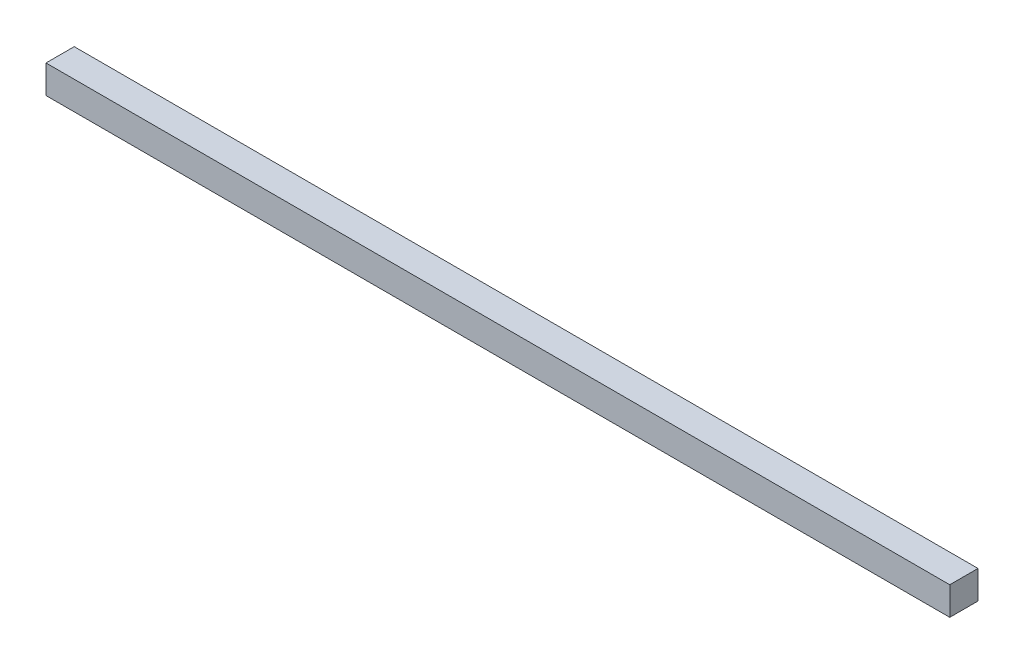
ISO-10303-21;
HEADER;
FILE_DESCRIPTION(('STEP AP214'),'2;1');
FILE_NAME('part.step','',(''),(''),'','','');
FILE_SCHEMA(('AUTOMOTIVE_DESIGN { 1 0 10303 214 1 1 1 1 }'));
ENDSEC;
DATA;
#1=APPLICATION_CONTEXT('core data for automotive mechanical design processes');
#2=APPLICATION_PROTOCOL_DEFINITION('international standard','automotive_design',2000,#1);
#3=PRODUCT_CONTEXT('',#1,'mechanical');
#4=PRODUCT('Part','Part','',(#3));
#5=PRODUCT_RELATED_PRODUCT_CATEGORY('part','',(#4));
#6=PRODUCT_DEFINITION_FORMATION('','',#4);
#7=PRODUCT_DEFINITION_CONTEXT('part definition',#1,'design');
#8=PRODUCT_DEFINITION('design','',#6,#7);
#9=PRODUCT_DEFINITION_SHAPE('','',#8);
#10=(LENGTH_UNIT() NAMED_UNIT(*) SI_UNIT(.MILLI.,.METRE.));
#11=(NAMED_UNIT(*) PLANE_ANGLE_UNIT() SI_UNIT($,.RADIAN.));
#12=(NAMED_UNIT(*) SI_UNIT($,.STERADIAN.) SOLID_ANGLE_UNIT());
#13=UNCERTAINTY_MEASURE_WITH_UNIT(LENGTH_MEASURE(1.E-05),#10,'distance_accuracy_value','');
#14=(GEOMETRIC_REPRESENTATION_CONTEXT(3) GLOBAL_UNCERTAINTY_ASSIGNED_CONTEXT((#13)) GLOBAL_UNIT_ASSIGNED_CONTEXT((#10,
#11,#12)) REPRESENTATION_CONTEXT('',''));
#15=CARTESIAN_POINT('',(0.,0.,0.));
#16=DIRECTION('',(0.,0.,1.));
#17=DIRECTION('',(1.,0.,0.));
#18=AXIS2_PLACEMENT_3D('',#15,#16,#17);
#19=CARTESIAN_POINT('',(0.,38.1,0.));
#20=DIRECTION('',(1.,0.,0.));
#21=DIRECTION('',(0.,0.,-1.));
#22=AXIS2_PLACEMENT_3D('',#19,#20,#21);
#23=PLANE('',#22);
#24=DIRECTION('',(0.,0.,1.));
#25=VECTOR('',#24,1.);
#26=CARTESIAN_POINT('',(0.,0.,0.));
#27=LINE('',#26,#25);
#28=CARTESIAN_POINT('',(0.,0.,-38.1));
#29=VERTEX_POINT('',#28);
#30=CARTESIAN_POINT('',(0.,0.,0.));
#31=VERTEX_POINT('',#30);
#32=EDGE_CURVE('E95',#29,#31,#27,.T.);
#33=ORIENTED_EDGE('',*,*,#32,.T.);
#34=DIRECTION('',(0.,-1.,0.));
#35=VECTOR('',#34,1.);
#36=CARTESIAN_POINT('',(0.,38.1,0.));
#37=LINE('',#36,#35);
#38=CARTESIAN_POINT('',(0.,38.1,0.));
#39=VERTEX_POINT('',#38);
#40=EDGE_CURVE('E11',#39,#31,#37,.T.);
#41=ORIENTED_EDGE('',*,*,#40,.F.);
#42=DIRECTION('',(0.,0.,1.));
#43=VECTOR('',#42,1.);
#44=CARTESIAN_POINT('',(0.,38.1,0.));
#45=LINE('',#44,#43);
#46=CARTESIAN_POINT('',(0.,38.1,-38.1));
#47=VERTEX_POINT('',#46);
#48=EDGE_CURVE('E83',#47,#39,#45,.T.);
#49=ORIENTED_EDGE('',*,*,#48,.F.);
#50=DIRECTION('',(0.,-1.,0.));
#51=VECTOR('',#50,1.);
#52=CARTESIAN_POINT('',(0.,38.1,-38.1));
#53=LINE('',#52,#51);
#54=EDGE_CURVE('E91',#47,#29,#53,.T.);
#55=ORIENTED_EDGE('',*,*,#54,.T.);
#56=EDGE_LOOP('',(#33,#41,#49,#55));
#57=FACE_BOUND('',#56,.T.);
#58=ADVANCED_FACE('F32',(#57),#23,.F.);
#59=CARTESIAN_POINT('',(0.,38.1,0.));
#60=DIRECTION('',(0.,0.,-1.));
#61=DIRECTION('',(-1.,0.,0.));
#62=AXIS2_PLACEMENT_3D('',#59,#60,#61);
#63=PLANE('',#62);
#64=DIRECTION('',(1.,0.,0.));
#65=VECTOR('',#64,1.);
#66=CARTESIAN_POINT('',(0.,0.,0.));
#67=LINE('',#66,#65);
#68=CARTESIAN_POINT('',(1219.2,0.,0.));
#69=VERTEX_POINT('',#68);
#70=EDGE_CURVE('E87',#31,#69,#67,.T.);
#71=ORIENTED_EDGE('',*,*,#70,.T.);
#72=DIRECTION('',(0.,-1.,0.));
#73=VECTOR('',#72,1.);
#74=CARTESIAN_POINT('',(1219.2,38.1,0.));
#75=LINE('',#74,#73);
#76=CARTESIAN_POINT('',(1219.2,38.1,0.));
#77=VERTEX_POINT('',#76);
#78=EDGE_CURVE('E40',#77,#69,#75,.T.);
#79=ORIENTED_EDGE('',*,*,#78,.F.);
#80=DIRECTION('',(1.,0.,0.));
#81=VECTOR('',#80,1.);
#82=CARTESIAN_POINT('',(0.,38.1,0.));
#83=LINE('',#82,#81);
#84=EDGE_CURVE('E78',#39,#77,#83,.T.);
#85=ORIENTED_EDGE('',*,*,#84,.F.);
#86=ORIENTED_EDGE('',*,*,#40,.T.);
#87=EDGE_LOOP('',(#71,#79,#85,#86));
#88=FACE_BOUND('',#87,.T.);
#89=ADVANCED_FACE('F86',(#88),#63,.F.);
#90=CARTESIAN_POINT('',(1219.2,38.1,0.));
#91=DIRECTION('',(-1.,0.,0.));
#92=DIRECTION('',(0.,0.,1.));
#93=AXIS2_PLACEMENT_3D('',#90,#91,#92);
#94=PLANE('',#93);
#95=DIRECTION('',(0.,0.,-1.));
#96=VECTOR('',#95,1.);
#97=CARTESIAN_POINT('',(1219.2,0.,0.));
#98=LINE('',#97,#96);
#99=CARTESIAN_POINT('',(1219.2,0.,-38.1));
#100=VERTEX_POINT('',#99);
#101=EDGE_CURVE('E65',#69,#100,#98,.T.);
#102=ORIENTED_EDGE('',*,*,#101,.T.);
#103=DIRECTION('',(0.,-1.,0.));
#104=VECTOR('',#103,1.);
#105=CARTESIAN_POINT('',(1219.2,38.1,-38.1));
#106=LINE('',#105,#104);
#107=CARTESIAN_POINT('',(1219.2,38.1,-38.1));
#108=VERTEX_POINT('',#107);
#109=EDGE_CURVE('E88',#108,#100,#106,.T.);
#110=ORIENTED_EDGE('',*,*,#109,.F.);
#111=DIRECTION('',(0.,0.,-1.));
#112=VECTOR('',#111,1.);
#113=CARTESIAN_POINT('',(1219.2,38.1,0.));
#114=LINE('',#113,#112);
#115=EDGE_CURVE('E81',#77,#108,#114,.T.);
#116=ORIENTED_EDGE('',*,*,#115,.F.);
#117=ORIENTED_EDGE('',*,*,#78,.T.);
#118=EDGE_LOOP('',(#102,#110,#116,#117));
#119=FACE_BOUND('',#118,.T.);
#120=ADVANCED_FACE('F89',(#119),#94,.F.);
#121=CARTESIAN_POINT('',(0.,38.1,-38.1));
#122=DIRECTION('',(0.,0.,1.));
#123=DIRECTION('',(1.,0.,0.));
#124=AXIS2_PLACEMENT_3D('',#121,#122,#123);
#125=PLANE('',#124);
#126=DIRECTION('',(-1.,0.,0.));
#127=VECTOR('',#126,1.);
#128=CARTESIAN_POINT('',(0.,0.,-38.1));
#129=LINE('',#128,#127);
#130=EDGE_CURVE('E71',#100,#29,#129,.T.);
#131=ORIENTED_EDGE('',*,*,#130,.T.);
#132=ORIENTED_EDGE('',*,*,#54,.F.);
#133=DIRECTION('',(-1.,0.,0.));
#134=VECTOR('',#133,1.);
#135=CARTESIAN_POINT('',(0.,38.1,-38.1));
#136=LINE('',#135,#134);
#137=EDGE_CURVE('E48',#108,#47,#136,.T.);
#138=ORIENTED_EDGE('',*,*,#137,.F.);
#139=ORIENTED_EDGE('',*,*,#109,.T.);
#140=EDGE_LOOP('',(#131,#132,#138,#139));
#141=FACE_BOUND('',#140,.T.);
#142=ADVANCED_FACE('F102',(#141),#125,.F.);
#143=CARTESIAN_POINT('',(0.,38.1,-38.1));
#144=DIRECTION('',(0.,-1.,0.));
#145=DIRECTION('',(0.,0.,-1.));
#146=AXIS2_PLACEMENT_3D('',#143,#144,#145);
#147=PLANE('',#146);
#148=ORIENTED_EDGE('',*,*,#48,.T.);
#149=ORIENTED_EDGE('',*,*,#84,.T.);
#150=ORIENTED_EDGE('',*,*,#115,.T.);
#151=ORIENTED_EDGE('',*,*,#137,.T.);
#152=EDGE_LOOP('',(#148,#149,#150,#151));
#153=FACE_BOUND('',#152,.T.);
#154=ADVANCED_FACE('F79',(#153),#147,.F.);
#155=CARTESIAN_POINT('',(0.,0.,-38.1));
#156=DIRECTION('',(0.,-1.,0.));
#157=DIRECTION('',(0.,0.,-1.));
#158=AXIS2_PLACEMENT_3D('',#155,#156,#157);
#159=PLANE('',#158);
#160=ORIENTED_EDGE('',*,*,#32,.F.);
#161=ORIENTED_EDGE('',*,*,#130,.F.);
#162=ORIENTED_EDGE('',*,*,#101,.F.);
#163=ORIENTED_EDGE('',*,*,#70,.F.);
#164=EDGE_LOOP('',(#160,#161,#162,#163));
#165=FACE_BOUND('',#164,.T.);
#166=ADVANCED_FACE('F105',(#165),#159,.T.);
#167=CLOSED_SHELL('',(#58,#89,#120,#142,#154,#166));
#168=MANIFOLD_SOLID_BREP('B2',#167);
#169=ADVANCED_BREP_SHAPE_REPRESENTATION('',(#18,#168),#14);
#170=SHAPE_DEFINITION_REPRESENTATION(#9,#169);
ENDSEC;
END-ISO-10303-21;
